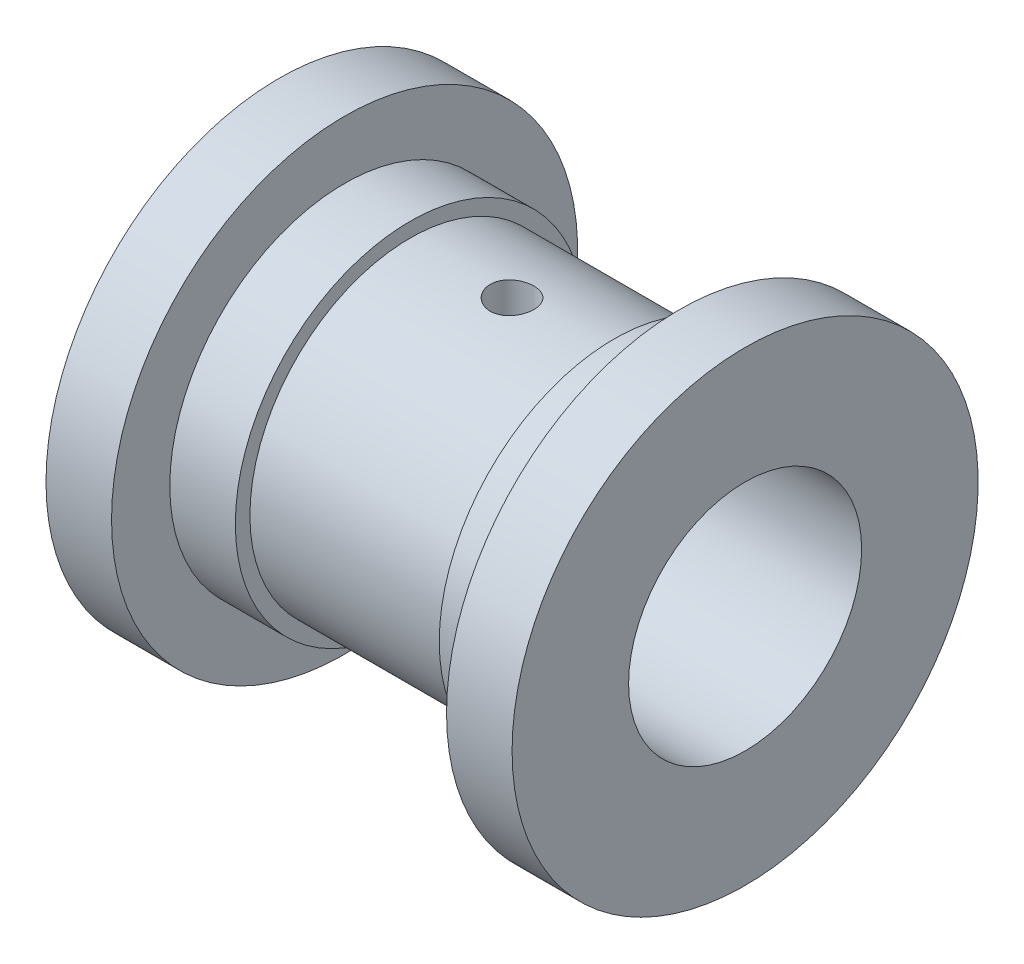
ISO-10303-21;
HEADER;
FILE_DESCRIPTION(('STEP AP214'),'2;1');
FILE_NAME('part.step','',(''),(''),'','','');
FILE_SCHEMA(('AUTOMOTIVE_DESIGN { 1 0 10303 214 1 1 1 1 }'));
ENDSEC;
DATA;
#1=APPLICATION_CONTEXT('core data for automotive mechanical design processes');
#2=APPLICATION_PROTOCOL_DEFINITION('international standard','automotive_design',2000,#1);
#3=PRODUCT_CONTEXT('',#1,'mechanical');
#4=PRODUCT('Part','Part','',(#3));
#5=PRODUCT_RELATED_PRODUCT_CATEGORY('part','',(#4));
#6=PRODUCT_DEFINITION_FORMATION('','',#4);
#7=PRODUCT_DEFINITION_CONTEXT('part definition',#1,'design');
#8=PRODUCT_DEFINITION('design','',#6,#7);
#9=PRODUCT_DEFINITION_SHAPE('','',#8);
#10=(LENGTH_UNIT() NAMED_UNIT(*) SI_UNIT(.MILLI.,.METRE.));
#11=(NAMED_UNIT(*) PLANE_ANGLE_UNIT() SI_UNIT($,.RADIAN.));
#12=(NAMED_UNIT(*) SI_UNIT($,.STERADIAN.) SOLID_ANGLE_UNIT());
#13=UNCERTAINTY_MEASURE_WITH_UNIT(LENGTH_MEASURE(1.E-05),#10,'distance_accuracy_value','');
#14=(GEOMETRIC_REPRESENTATION_CONTEXT(3) GLOBAL_UNCERTAINTY_ASSIGNED_CONTEXT((#13)) GLOBAL_UNIT_ASSIGNED_CONTEXT((#10,
#11,#12)) REPRESENTATION_CONTEXT('',''));
#15=CARTESIAN_POINT('',(0.,0.,0.));
#16=DIRECTION('',(0.,0.,1.));
#17=DIRECTION('',(1.,0.,0.));
#18=AXIS2_PLACEMENT_3D('',#15,#16,#17);
#19=CARTESIAN_POINT('',(-34.4291845493563,0.,0.));
#20=DIRECTION('',(-1.,0.,0.));
#21=DIRECTION('',(0.,0.,1.));
#22=AXIS2_PLACEMENT_3D('',#19,#20,#21);
#23=CYLINDRICAL_SURFACE('',#22,24.0000000000001);
#24=CARTESIAN_POINT('',(13.9999999999998,0.,0.));
#25=DIRECTION('',(-1.,0.,0.));
#26=DIRECTION('',(0.,0.,1.));
#27=AXIS2_PLACEMENT_3D('',#24,#25,#26);
#28=CIRCLE('',#27,24.0000000000001);
#29=CARTESIAN_POINT('',(13.9999999999998,0.,24.0000000000001));
#30=VERTEX_POINT('',#29);
#31=EDGE_CURVE('E12',#30,#30,#28,.T.);
#32=ORIENTED_EDGE('',*,*,#31,.F.);
#33=EDGE_LOOP('',(#32));
#34=FACE_BOUND('',#33,.T.);
#35=CARTESIAN_POINT('',(22.9999999999999,0.,0.));
#36=DIRECTION('',(-1.,0.,0.));
#37=DIRECTION('',(0.,0.,1.));
#38=AXIS2_PLACEMENT_3D('',#35,#36,#37);
#39=CIRCLE('',#38,24.0000000000002);
#40=CARTESIAN_POINT('',(22.9999999999999,0.,24.0000000000002));
#41=VERTEX_POINT('',#40);
#42=EDGE_CURVE('E81',#41,#41,#39,.T.);
#43=ORIENTED_EDGE('',*,*,#42,.T.);
#44=EDGE_LOOP('',(#43));
#45=FACE_BOUND('',#44,.T.);
#46=ADVANCED_FACE('F52',(#34,#45),#23,.T.);
#47=CARTESIAN_POINT('',(13.9999999999998,22.0000000000001,0.));
#48=DIRECTION('',(1.,0.,0.));
#49=DIRECTION('',(0.,0.,-1.));
#50=AXIS2_PLACEMENT_3D('',#47,#48,#49);
#51=PLANE('',#50);
#52=CARTESIAN_POINT('',(13.9999999999998,0.,0.));
#53=DIRECTION('',(-1.,0.,0.));
#54=DIRECTION('',(0.,0.,1.));
#55=AXIS2_PLACEMENT_3D('',#52,#53,#54);
#56=CIRCLE('',#55,22.0000000000001);
#57=CARTESIAN_POINT('',(13.9999999999998,0.,22.0000000000001));
#58=VERTEX_POINT('',#57);
#59=EDGE_CURVE('E68',#58,#58,#56,.T.);
#60=ORIENTED_EDGE('',*,*,#59,.F.);
#61=EDGE_LOOP('',(#60));
#62=FACE_BOUND('',#61,.T.);
#63=ORIENTED_EDGE('',*,*,#31,.T.);
#64=EDGE_LOOP('',(#63));
#65=FACE_BOUND('',#64,.T.);
#66=ADVANCED_FACE('F133',(#62,#65),#51,.F.);
#67=CARTESIAN_POINT('',(-34.4291845493563,0.,0.));
#68=DIRECTION('',(-1.,0.,0.));
#69=DIRECTION('',(0.,0.,1.));
#70=AXIS2_PLACEMENT_3D('',#67,#68,#69);
#71=CYLINDRICAL_SURFACE('',#70,22.);
#72=CARTESIAN_POINT('',(0.,21.7944947177035,-3.));
#73=CARTESIAN_POINT('',(0.167668655793948,21.7944973125223,-2.9999929539783));
#74=CARTESIAN_POINT('',(0.33543888557203,21.7964504822142,-2.98589613516891));
#75=CARTESIAN_POINT('',(0.666300949403478,21.8040481680047,-2.92988930626151));
#76=CARTESIAN_POINT('',(0.829387860056604,21.8096964302678,-2.88795106929477));
#77=CARTESIAN_POINT('',(1.14604557101646,21.8240329226109,-2.77752885626789));
#78=CARTESIAN_POINT('',(1.29962310318686,21.8327189725424,-2.70906391400623));
#79=CARTESIAN_POINT('',(1.59308393749808,21.8521497354894,-2.54757436301584));
#80=CARTESIAN_POINT('',(1.73296937813156,21.8628941262462,-2.4545535979434));
#81=CARTESIAN_POINT('',(1.99602918996941,21.8853107439762,-2.24593261550097));
#82=CARTESIAN_POINT('',(2.11909952067153,21.8969880962733,-2.13020174404838));
#83=CARTESIAN_POINT('',(2.34413561137156,21.919908962518,-1.87972745186891));
#84=CARTESIAN_POINT('',(2.44610027468492,21.9311524538967,-1.74498304377947));
#85=CARTESIAN_POINT('',(2.62640880979328,21.9519917823357,-1.45964673364279));
#86=CARTESIAN_POINT('',(2.70465775314382,21.9615809332172,-1.30899431491142));
#87=CARTESIAN_POINT('',(2.83470513621752,21.9779746087793,-0.996533559622184));
#88=CARTESIAN_POINT('',(2.8865047367614,21.9847792556648,-0.834725713012606));
#89=CARTESIAN_POINT('',(2.96187006393203,21.9948010960819,-0.505615027627435));
#90=CARTESIAN_POINT('',(2.98560939170292,21.9980403391052,-0.338352625202445));
#91=CARTESIAN_POINT('',(3.0047187619281,22.0006418160325,-0.00218901989867563));
#92=CARTESIAN_POINT('',(3.0000901200992,22.0000042297454,0.166712106612716));
#93=CARTESIAN_POINT('',(2.96273314482708,21.9949416293269,0.500176134095477));
#94=CARTESIAN_POINT('',(2.93019154096824,21.9905417842194,0.664760389901237));
#95=CARTESIAN_POINT('',(2.83822479796856,21.9784771616626,0.986109968659597));
#96=CARTESIAN_POINT('',(2.77879906739163,21.9708123123852,1.14287511951192));
#97=CARTESIAN_POINT('',(2.63455559502035,21.9530355245634,1.44470900216684));
#98=CARTESIAN_POINT('',(2.54965799841275,21.9429159096716,1.58973910165));
#99=CARTESIAN_POINT('',(2.35693890109397,21.9213599095811,1.86356465940336));
#100=CARTESIAN_POINT('',(2.24911615051491,21.9099234526045,1.99235923191072));
#101=CARTESIAN_POINT('',(2.0125639881594,21.8869019715346,2.23115639122854));
#102=CARTESIAN_POINT('',(1.88367170498199,21.8753164955576,2.34099765683573));
#103=CARTESIAN_POINT('',(1.60919608132633,21.8533940433535,2.53751386076588));
#104=CARTESIAN_POINT('',(1.46361266894254,21.8430570725053,2.62418869928229));
#105=CARTESIAN_POINT('',(1.15973309839799,21.8248023099057,2.77192629130128));
#106=CARTESIAN_POINT('',(1.00142980323134,21.816885888441,2.83297454471217));
#107=CARTESIAN_POINT('',(0.676685938855074,21.8043941534575,2.92757469616756));
#108=CARTESIAN_POINT('',(0.510245840045014,21.7998186470391,2.96112818173428));
#109=CARTESIAN_POINT('',(0.175382312986139,21.7945626889125,2.99956941672123));
#110=CARTESIAN_POINT('',(0.0069854967609881,21.793851292977,3.00468490854898));
#111=CARTESIAN_POINT('',(-0.328262835866369,21.7963221316712,2.98670732293097));
#112=CARTESIAN_POINT('',(-0.495114391544092,21.7995042670648,2.96361496443092));
#113=CARTESIAN_POINT('',(-0.821843465157813,21.8093753071635,2.89006955453772));
#114=CARTESIAN_POINT('',(-0.981746585492409,21.8160498979624,2.83972815512373));
#115=CARTESIAN_POINT('',(-1.29084344925954,21.8321421092609,2.71322912313731));
#116=CARTESIAN_POINT('',(-1.44003674919166,21.8415598432742,2.63707042220062));
#117=CARTESIAN_POINT('',(-1.72450521244548,21.8621508077798,2.46054424209314));
#118=CARTESIAN_POINT('',(-1.8596874322528,21.8733346554528,2.36002824545059));
#119=CARTESIAN_POINT('',(-2.11134500486869,21.8961649833417,2.13784918546693));
#120=CARTESIAN_POINT('',(-2.22781948780179,21.9078114850388,2.01618513932767));
#121=CARTESIAN_POINT('',(-2.43956305361876,21.9303506440046,1.75416517490266));
#122=CARTESIAN_POINT('',(-2.53468192892497,21.9412376115705,1.61368731048529));
#123=CARTESIAN_POINT('',(-2.69997177807763,21.9609445601932,1.3186156356417));
#124=CARTESIAN_POINT('',(-2.77014333476212,21.9697645895377,1.1640221551012));
#125=CARTESIAN_POINT('',(-2.88330205185712,21.9843187797623,0.845593617063891));
#126=CARTESIAN_POINT('',(-2.9263739872929,21.9900625555325,0.681789143548593));
#127=CARTESIAN_POINT('',(-2.98438601535218,21.9978571930976,0.349189125620978));
#128=CARTESIAN_POINT('',(-2.99932763043918,21.9999082547486,0.180393851821991));
#129=CARTESIAN_POINT('',(-3.00062266554238,22.0000849669785,-0.155933944793822));
#130=CARTESIAN_POINT('',(-2.98720691376541,21.9982423123404,-0.323465608547036));
#131=CARTESIAN_POINT('',(-2.93265946872279,21.9909020074537,-0.653868527504477));
#132=CARTESIAN_POINT('',(-2.89152782222594,21.9854043633727,-0.816739790572345));
#133=CARTESIAN_POINT('',(-2.78279281440875,21.9713688879314,-1.1331538776586));
#134=CARTESIAN_POINT('',(-2.71520266767051,21.962832574414,-1.28670131426867));
#135=CARTESIAN_POINT('',(-2.55549339551869,21.9436616719154,-1.58031159285158));
#136=CARTESIAN_POINT('',(-2.46337375671115,21.9330270390185,-1.72037415250695));
#137=CARTESIAN_POINT('',(-2.2563744265564,21.9107413064256,-1.9842147286039));
#138=CARTESIAN_POINT('',(-2.14132346408358,21.8990829513431,-2.10785776937321));
#139=CARTESIAN_POINT('',(-1.89208624401357,21.8761200052605,-2.33416948478686));
#140=CARTESIAN_POINT('',(-1.75789548220959,21.864815498298,-2.43683320845298));
#141=CARTESIAN_POINT('',(-1.47347030664262,21.8437846234674,-2.61868613380127));
#142=CARTESIAN_POINT('',(-1.3231649084022,21.8340657568727,-2.69776514213644));
#143=CARTESIAN_POINT('',(-1.0113524153603,21.817394367016,-2.8294429199818));
#144=CARTESIAN_POINT('',(-0.849857473558353,21.8104388960615,-2.8820699216208));
#145=CARTESIAN_POINT('',(-0.572977203514035,21.8017355288375,-2.94703203226376));
#146=CARTESIAN_POINT('',(-0.459323577603224,21.7990341203125,-2.96686567785599));
#147=CARTESIAN_POINT('',(-0.230462622878638,21.7954128315746,-2.99335201931174));
#148=CARTESIAN_POINT('',(-0.115255309193865,21.7944929340269,-3.00000484343008));
#149=CARTESIAN_POINT('',(0.,21.7944947177035,-3.));
#150=B_SPLINE_CURVE_WITH_KNOTS('',3,(#72,#73,#74,#75,#76,#77,#78,#79,#80,#81,#82,#83,#84,#85,
#86,#87,#88,#89,#90,#91,#92,#93,#94,#95,#96,#97,#98,#99,#100,#101,#102,#103,#104,#105,#106,#107,
#108,#109,#110,#111,#112,#113,#114,#115,#116,#117,#118,#119,#120,#121,#122,#123,#124,#125,#126,
#127,#128,#129,#130,#131,#132,#133,#134,#135,#136,#137,#138,#139,#140,#141,#142,#143,#144,#145,
#146,#147,#148,#149),.UNSPECIFIED.,.T.,.F.,(4,2,2,2,2,2,2,2,2,2,2,2,2,2,2,2,2,2,2,2,2,2,2,2,2,2,
2,2,2,2,2,2,2,2,2,2,2,2,4),(0.,0.502584827322588,1.00567997726422,1.50841480614363,
2.01107098991684,2.51670860353082,3.0223724842993,3.53003447052544,4.03767417433729,
4.54215653413512,5.04661549603351,5.54772586150297,6.04884725166252,6.5515563813218,
7.05429292546104,7.56111742626902,8.06794411056388,8.57505718337538,9.08214097388771,
9.58515792757108,10.088162060911,10.5891205844916,11.0900998411273,11.5942142584276,
12.0983521093424,12.605931923378,13.1134998781727,13.6194720220334,14.1254167809851,
14.6272590296531,15.1291004314969,15.6306915099824,16.1322930874248,16.6377918045005,
17.1434096784682,17.6513541852326,18.158755407386,18.5042352052812,18.8497116414995),.UNSPECIFIED.);
#151=CARTESIAN_POINT('',(0.,21.7944947177035,-3.));
#152=VERTEX_POINT('',#151);
#153=EDGE_CURVE('E215',#152,#152,#150,.T.);
#154=ORIENTED_EDGE('',*,*,#153,.T.);
#155=EDGE_LOOP('',(#154));
#156=FACE_BOUND('',#155,.T.);
#157=CARTESIAN_POINT('',(0.,-21.633307652784,4.));
#158=CARTESIAN_POINT('',(0.222680245145932,-21.6333118939646,3.99999133497669));
#159=CARTESIAN_POINT('',(0.445474382576035,-21.6367831728321,3.98134200846101));
#160=CARTESIAN_POINT('',(0.88478923174598,-21.650277261808,3.90728263932398));
#161=CARTESIAN_POINT('',(1.10130431933861,-21.6603057667964,3.85184064204134));
#162=CARTESIAN_POINT('',(1.52164062603706,-21.6857418061114,3.70594738579433));
#163=CARTESIAN_POINT('',(1.72547313061613,-21.7011444752348,3.61552778385547));
#164=CARTESIAN_POINT('',(2.1150597832579,-21.7355875966024,3.40232850816632));
#165=CARTESIAN_POINT('',(2.30081551603269,-21.7546277295314,3.2795516745396));
#166=CARTESIAN_POINT('',(2.65116689488345,-21.7944494758657,3.00359049647932));
#167=CARTESIAN_POINT('',(2.81552014846788,-21.8152472612913,2.85010070695623));
#168=CARTESIAN_POINT('',(3.11629112566885,-21.8560978635287,2.51773079268323));
#169=CARTESIAN_POINT('',(3.25270706729073,-21.8761506327526,2.33884904952696));
#170=CARTESIAN_POINT('',(3.49465463690044,-21.9134244798489,1.95918683799967));
#171=CARTESIAN_POINT('',(3.5999585399916,-21.9306242928061,1.75825898095974));
#172=CARTESIAN_POINT('',(3.77522666605231,-21.9600735467303,1.34119954887521));
#173=CARTESIAN_POINT('',(3.84519362101877,-21.9723233703801,1.12506915065336));
#174=CARTESIAN_POINT('',(3.94705446651093,-21.9903782117667,0.686249675641723));
#175=CARTESIAN_POINT('',(3.97935662864145,-21.996252290905,0.463658257037538));
#176=CARTESIAN_POINT('',(4.0062423349248,-22.0011316177893,0.0161429459318372));
#177=CARTESIAN_POINT('',(4.00082890714308,-22.0001374169679,-0.208780757870097));
#178=CARTESIAN_POINT('',(3.95275171584415,-21.9914463710423,-0.651778392281494));
#179=CARTESIAN_POINT('',(3.9105274929711,-21.9838286175382,-0.869901800106697));
#180=CARTESIAN_POINT('',(3.79072160507702,-21.9628349381596,-1.29591498120672));
#181=CARTESIAN_POINT('',(3.71313870922762,-21.9494588118381,-1.50380439795921));
#182=CARTESIAN_POINT('',(3.52439388044179,-21.9183184074471,-1.90473245090768));
#183=CARTESIAN_POINT('',(3.41305471193237,-21.9005310604677,-2.09768578503489));
#184=CARTESIAN_POINT('',(3.16008822015064,-21.8625379364345,-2.46233526714581));
#185=CARTESIAN_POINT('',(3.01845799412906,-21.8423319276857,-2.63402937539643));
#186=CARTESIAN_POINT('',(2.7065030908415,-21.8013981618569,-2.95388890108789));
#187=CARTESIAN_POINT('',(2.53579396416207,-21.7806670830423,-3.10167918809898));
#188=CARTESIAN_POINT('',(2.17181187215817,-21.7412992413717,-3.36658543928328));
#189=CARTESIAN_POINT('',(1.97853861446947,-21.7226625056582,-3.48370100593928));
#190=CARTESIAN_POINT('',(1.57443497902635,-21.6895894681968,-3.6840307649818));
#191=CARTESIAN_POINT('',(1.36357833672045,-21.6751596002548,-3.76719310770443));
#192=CARTESIAN_POINT('',(0.930565100223314,-21.6522346695388,-3.89680753773995));
#193=CARTESIAN_POINT('',(0.708409706977764,-21.6437389774288,-3.94326351793347));
#194=CARTESIAN_POINT('',(0.262480397589217,-21.633768081855,-3.99760435703087));
#195=CARTESIAN_POINT('',(0.0387741346607441,-21.6321950076556,-4.00602696978327));
#196=CARTESIAN_POINT('',(-0.406849101122184,-21.6359859030779,-3.98550109557701));
#197=CARTESIAN_POINT('',(-0.628766156427988,-21.6413495511774,-3.95655434071582));
#198=CARTESIAN_POINT('',(-1.06276068810463,-21.6583185875736,-3.86257219277797));
#199=CARTESIAN_POINT('',(-1.2749007680161,-21.6698756001578,-3.7978163771075));
#200=CARTESIAN_POINT('',(-1.68531943765693,-21.6978878160151,-3.63434995143753));
#201=CARTESIAN_POINT('',(-1.88359705817142,-21.7143433613546,-3.53563697012219));
#202=CARTESIAN_POINT('',(-2.26303839203054,-21.7505226830533,-3.3058117237599));
#203=CARTESIAN_POINT('',(-2.44399223616878,-21.7702800968596,-3.17435835883131));
#204=CARTESIAN_POINT('',(-2.78146738319553,-21.8107413258405,-2.88324609901471));
#205=CARTESIAN_POINT('',(-2.93798662399939,-21.8314452207001,-2.72358482602653));
#206=CARTESIAN_POINT('',(-3.22414569229964,-21.8717797209063,-2.37819260014527));
#207=CARTESIAN_POINT('',(-3.35342471072362,-21.8913936565352,-2.19216046504753));
#208=CARTESIAN_POINT('',(-3.578892612166,-21.9270616275554,-1.80070523958703));
#209=CARTESIAN_POINT('',(-3.67508271455441,-21.9431157941212,-1.59528286413569));
#210=CARTESIAN_POINT('',(-3.83109607727294,-21.9697834526315,-1.17189643669068));
#211=CARTESIAN_POINT('',(-3.89109980975307,-21.9804239020959,-0.954000658707872));
#212=CARTESIAN_POINT('',(-3.97361468659431,-21.9951799495619,-0.511013297926922));
#213=CARTESIAN_POINT('',(-3.99612953027346,-21.9992961913555,-0.285922427358434));
#214=CARTESIAN_POINT('',(-4.00290504221109,-22.0005282842777,0.161599238057638));
#215=CARTESIAN_POINT('',(-3.9877117769694,-21.9977440646225,0.384021675850886));
#216=CARTESIAN_POINT('',(-3.92069410715211,-21.9856946780428,0.823089077981702));
#217=CARTESIAN_POINT('',(-3.86887000960196,-21.9764295654387,1.03973409072761));
#218=CARTESIAN_POINT('',(-3.73028619302146,-21.9524581381546,1.46083086688082));
#219=CARTESIAN_POINT('',(-3.64358130924887,-21.93776036696,1.66530119329237));
#220=CARTESIAN_POINT('',(-3.4377611943825,-21.9045184478406,2.05687402388435));
#221=CARTESIAN_POINT('',(-3.31864396744523,-21.885974063071,2.24397545759474));
#222=CARTESIAN_POINT('',(-3.04948472287628,-21.8467718041458,2.59822919507103));
#223=CARTESIAN_POINT('',(-2.89904660923134,-21.826088758947,2.76507779716899));
#224=CARTESIAN_POINT('',(-2.5723409666129,-21.7851034058444,3.07135244710173));
#225=CARTESIAN_POINT('',(-2.39606738287675,-21.7648011884524,3.21077204872681));
#226=CARTESIAN_POINT('',(-2.02088064879774,-21.7266856567864,3.4593534360722));
#227=CARTESIAN_POINT('',(-1.82178552137727,-21.7088952940927,3.56824417003714));
#228=CARTESIAN_POINT('',(-1.40787344654802,-21.6780923491354,3.75086117813967));
#229=CARTESIAN_POINT('',(-1.19307181678438,-21.6650751844593,3.82462119925563));
#230=CARTESIAN_POINT('',(-0.814646631135513,-21.6480562150115,3.91959792411041));
#231=CARTESIAN_POINT('',(-0.653261474782786,-21.642557744208,3.94969798379533));
#232=CARTESIAN_POINT('',(-0.327938095935641,-21.6351819455147,3.98990196850046));
#233=CARTESIAN_POINT('',(-0.163999935860687,-21.6333045292319,4.00000638163151));
#234=CARTESIAN_POINT('',(0.,-21.633307652784,4.));
#235=B_SPLINE_CURVE_WITH_KNOTS('',3,(#157,#158,#159,#160,#161,#162,#163,#164,#165,#166,#167,
#168,#169,#170,#171,#172,#173,#174,#175,#176,#177,#178,#179,#180,#181,#182,#183,#184,#185,#186,
#187,#188,#189,#190,#191,#192,#193,#194,#195,#196,#197,#198,#199,#200,#201,#202,#203,#204,#205,
#206,#207,#208,#209,#210,#211,#212,#213,#214,#215,#216,#217,#218,#219,#220,#221,#222,#223,#224,
#225,#226,#227,#228,#229,#230,#231,#232,#233,#234),.UNSPECIFIED.,.T.,.F.,(4,2,2,2,2,2,2,2,2,2,2,
2,2,2,2,2,2,2,2,2,2,2,2,2,2,2,2,2,2,2,2,2,2,2,2,2,2,2,4),(0.,0.667440705257576,1.33546184685079,
2.00287979476301,2.67023918023363,3.34459870230516,4.01900122532958,4.69822425023956,
5.37739475450277,6.04913278831926,6.72081689103462,7.38458890585931,8.04838402822071,
8.71572656975954,9.38313309046878,10.0601670169629,10.7372097167831,11.4152824897346,
12.0932833402557,12.7616672929396,13.4300202666519,14.0932273132436,14.7564806826868,
15.4269564046825,16.0974886789027,16.7764104513919,17.4553072020416,18.1307894735074,
18.8062050859726,19.4718969577387,20.1375832499996,20.8022270968082,21.4669118794232,
22.1405775941433,22.8144014413678,23.4940309659146,24.1730063069363,24.6645762030324,
25.1561340993394),.UNSPECIFIED.);
#236=CARTESIAN_POINT('',(0.,-21.633307652784,4.));
#237=VERTEX_POINT('',#236);
#238=EDGE_CURVE('E80',#237,#237,#235,.T.);
#239=ORIENTED_EDGE('',*,*,#238,.T.);
#240=EDGE_LOOP('',(#239));
#241=FACE_BOUND('',#240,.T.);
#242=CARTESIAN_POINT('',(-14.,0.,0.));
#243=DIRECTION('',(-1.,0.,0.));
#244=DIRECTION('',(0.,0.,1.));
#245=AXIS2_PLACEMENT_3D('',#242,#243,#244);
#246=CIRCLE('',#245,22.);
#247=CARTESIAN_POINT('',(-14.,0.,22.));
#248=VERTEX_POINT('',#247);
#249=EDGE_CURVE('E71',#248,#248,#246,.T.);
#250=ORIENTED_EDGE('',*,*,#249,.F.);
#251=EDGE_LOOP('',(#250));
#252=FACE_BOUND('',#251,.T.);
#253=ORIENTED_EDGE('',*,*,#59,.T.);
#254=EDGE_LOOP('',(#253));
#255=FACE_BOUND('',#254,.T.);
#256=ADVANCED_FACE('F93',(#156,#241,#252,#255),#71,.T.);
#257=CARTESIAN_POINT('',(-14.,22.,0.));
#258=DIRECTION('',(-1.,0.,0.));
#259=DIRECTION('',(0.,0.,1.));
#260=AXIS2_PLACEMENT_3D('',#257,#258,#259);
#261=PLANE('',#260);
#262=CARTESIAN_POINT('',(-14.,0.,0.));
#263=DIRECTION('',(-1.,0.,0.));
#264=DIRECTION('',(0.,0.,1.));
#265=AXIS2_PLACEMENT_3D('',#262,#263,#264);
#266=CIRCLE('',#265,24.);
#267=CARTESIAN_POINT('',(-14.,0.,24.));
#268=VERTEX_POINT('',#267);
#269=EDGE_CURVE('E173',#268,#268,#266,.T.);
#270=ORIENTED_EDGE('',*,*,#269,.F.);
#271=EDGE_LOOP('',(#270));
#272=FACE_BOUND('',#271,.T.);
#273=ORIENTED_EDGE('',*,*,#249,.T.);
#274=EDGE_LOOP('',(#273));
#275=FACE_BOUND('',#274,.T.);
#276=ADVANCED_FACE('F130',(#272,#275),#261,.F.);
#277=CARTESIAN_POINT('',(-34.4291845493563,0.,0.));
#278=DIRECTION('',(-1.,0.,0.));
#279=DIRECTION('',(0.,0.,1.));
#280=AXIS2_PLACEMENT_3D('',#277,#278,#279);
#281=CYLINDRICAL_SURFACE('',#280,24.);
#282=CARTESIAN_POINT('',(-22.9999999999999,0.,0.));
#283=DIRECTION('',(-1.,0.,0.));
#284=DIRECTION('',(0.,0.,1.));
#285=AXIS2_PLACEMENT_3D('',#282,#283,#284);
#286=CIRCLE('',#285,24.);
#287=CARTESIAN_POINT('',(-22.9999999999999,0.,24.));
#288=VERTEX_POINT('',#287);
#289=EDGE_CURVE('E172',#288,#288,#286,.T.);
#290=ORIENTED_EDGE('',*,*,#289,.F.);
#291=EDGE_LOOP('',(#290));
#292=FACE_BOUND('',#291,.T.);
#293=ORIENTED_EDGE('',*,*,#269,.T.);
#294=EDGE_LOOP('',(#293));
#295=FACE_BOUND('',#294,.T.);
#296=ADVANCED_FACE('F125',(#292,#295),#281,.T.);
#297=CARTESIAN_POINT('',(-22.9999999999999,24.,0.));
#298=DIRECTION('',(-1.,0.,0.));
#299=DIRECTION('',(0.,0.,1.));
#300=AXIS2_PLACEMENT_3D('',#297,#298,#299);
#301=PLANE('',#300);
#302=CARTESIAN_POINT('',(-22.9999999999999,0.,0.));
#303=DIRECTION('',(-1.,0.,0.));
#304=DIRECTION('',(0.,0.,1.));
#305=AXIS2_PLACEMENT_3D('',#302,#303,#304);
#306=CIRCLE('',#305,32.);
#307=CARTESIAN_POINT('',(-22.9999999999999,0.,32.));
#308=VERTEX_POINT('',#307);
#309=EDGE_CURVE('E170',#308,#308,#306,.T.);
#310=ORIENTED_EDGE('',*,*,#309,.F.);
#311=EDGE_LOOP('',(#310));
#312=FACE_BOUND('',#311,.T.);
#313=ORIENTED_EDGE('',*,*,#289,.T.);
#314=EDGE_LOOP('',(#313));
#315=FACE_BOUND('',#314,.T.);
#316=ADVANCED_FACE('F118',(#312,#315),#301,.F.);
#317=CARTESIAN_POINT('',(-34.4291845493563,0.,0.));
#318=DIRECTION('',(-1.,0.,0.));
#319=DIRECTION('',(0.,0.,1.));
#320=AXIS2_PLACEMENT_3D('',#317,#318,#319);
#321=CYLINDRICAL_SURFACE('',#320,32.);
#322=CARTESIAN_POINT('',(-32.,0.,0.));
#323=DIRECTION('',(-1.,0.,0.));
#324=DIRECTION('',(0.,0.,1.));
#325=AXIS2_PLACEMENT_3D('',#322,#323,#324);
#326=CIRCLE('',#325,32.);
#327=CARTESIAN_POINT('',(-32.,0.,32.));
#328=VERTEX_POINT('',#327);
#329=EDGE_CURVE('E162',#328,#328,#326,.T.);
#330=ORIENTED_EDGE('',*,*,#329,.F.);
#331=EDGE_LOOP('',(#330));
#332=FACE_BOUND('',#331,.T.);
#333=ORIENTED_EDGE('',*,*,#309,.T.);
#334=EDGE_LOOP('',(#333));
#335=FACE_BOUND('',#334,.T.);
#336=ADVANCED_FACE('F117',(#332,#335),#321,.T.);
#337=CARTESIAN_POINT('',(-32.,32.,0.));
#338=DIRECTION('',(1.,0.,0.));
#339=DIRECTION('',(0.,0.,-1.));
#340=AXIS2_PLACEMENT_3D('',#337,#338,#339);
#341=PLANE('',#340);
#342=CARTESIAN_POINT('',(-32.,0.,0.));
#343=DIRECTION('',(1.,0.,0.));
#344=DIRECTION('',(0.,0.,-1.));
#345=AXIS2_PLACEMENT_3D('',#342,#343,#344);
#346=CIRCLE('',#345,16.);
#347=CARTESIAN_POINT('',(-32.,0.,-16.));
#348=VERTEX_POINT('',#347);
#349=EDGE_CURVE('E204',#348,#348,#346,.F.);
#350=ORIENTED_EDGE('',*,*,#349,.F.);
#351=EDGE_LOOP('',(#350));
#352=FACE_BOUND('',#351,.T.);
#353=ORIENTED_EDGE('',*,*,#329,.T.);
#354=EDGE_LOOP('',(#353));
#355=FACE_BOUND('',#354,.T.);
#356=ADVANCED_FACE('F115',(#352,#355),#341,.F.);
#357=CARTESIAN_POINT('',(31.9999999999998,32.0000000000002,0.));
#358=DIRECTION('',(-1.,0.,0.));
#359=DIRECTION('',(0.,0.,1.));
#360=AXIS2_PLACEMENT_3D('',#357,#358,#359);
#361=PLANE('',#360);
#362=CARTESIAN_POINT('',(31.9999999999998,0.,0.));
#363=DIRECTION('',(1.,0.,0.));
#364=DIRECTION('',(0.,0.,-1.));
#365=AXIS2_PLACEMENT_3D('',#362,#363,#364);
#366=CIRCLE('',#365,16.);
#367=CARTESIAN_POINT('',(31.9999999999998,0.,-16.));
#368=VERTEX_POINT('',#367);
#369=EDGE_CURVE('E208',#368,#368,#366,.T.);
#370=ORIENTED_EDGE('',*,*,#369,.F.);
#371=EDGE_LOOP('',(#370));
#372=FACE_BOUND('',#371,.T.);
#373=CARTESIAN_POINT('',(31.9999999999998,0.,0.));
#374=DIRECTION('',(-1.,0.,0.));
#375=DIRECTION('',(0.,0.,1.));
#376=AXIS2_PLACEMENT_3D('',#373,#374,#375);
#377=CIRCLE('',#376,32.0000000000002);
#378=CARTESIAN_POINT('',(31.9999999999998,0.,32.0000000000002));
#379=VERTEX_POINT('',#378);
#380=EDGE_CURVE('E154',#379,#379,#377,.T.);
#381=ORIENTED_EDGE('',*,*,#380,.F.);
#382=EDGE_LOOP('',(#381));
#383=FACE_BOUND('',#382,.T.);
#384=ADVANCED_FACE('F107',(#372,#383),#361,.F.);
#385=CARTESIAN_POINT('',(-34.4291845493563,0.,0.));
#386=DIRECTION('',(-1.,0.,0.));
#387=DIRECTION('',(0.,0.,1.));
#388=AXIS2_PLACEMENT_3D('',#385,#386,#387);
#389=CYLINDRICAL_SURFACE('',#388,32.0000000000002);
#390=CARTESIAN_POINT('',(22.9999999999997,0.,0.));
#391=DIRECTION('',(-1.,0.,0.));
#392=DIRECTION('',(0.,0.,1.));
#393=AXIS2_PLACEMENT_3D('',#390,#391,#392);
#394=CIRCLE('',#393,32.0000000000002);
#395=CARTESIAN_POINT('',(22.9999999999997,0.,32.0000000000002));
#396=VERTEX_POINT('',#395);
#397=EDGE_CURVE('E147',#396,#396,#394,.T.);
#398=ORIENTED_EDGE('',*,*,#397,.F.);
#399=EDGE_LOOP('',(#398));
#400=FACE_BOUND('',#399,.T.);
#401=ORIENTED_EDGE('',*,*,#380,.T.);
#402=EDGE_LOOP('',(#401));
#403=FACE_BOUND('',#402,.T.);
#404=ADVANCED_FACE('F102',(#400,#403),#389,.T.);
#405=CARTESIAN_POINT('',(22.9999999999999,24.0000000000001,0.));
#406=DIRECTION('',(1.,0.,0.));
#407=DIRECTION('',(0.,0.,-1.));
#408=AXIS2_PLACEMENT_3D('',#405,#406,#407);
#409=PLANE('',#408);
#410=ORIENTED_EDGE('',*,*,#42,.F.);
#411=EDGE_LOOP('',(#410));
#412=FACE_BOUND('',#411,.T.);
#413=ORIENTED_EDGE('',*,*,#397,.T.);
#414=EDGE_LOOP('',(#413));
#415=FACE_BOUND('',#414,.T.);
#416=ADVANCED_FACE('F99',(#412,#415),#409,.F.);
#417=CARTESIAN_POINT('',(0.,-30.,0.));
#418=DIRECTION('',(0.,1.,0.));
#419=DIRECTION('',(0.,0.,1.));
#420=AXIS2_PLACEMENT_3D('',#417,#418,#419);
#421=CYLINDRICAL_SURFACE('',#420,4.);
#422=CARTESIAN_POINT('',(0.,-30.,0.));
#423=DIRECTION('',(0.,1.,0.));
#424=DIRECTION('',(0.,0.,1.));
#425=AXIS2_PLACEMENT_3D('',#422,#423,#424);
#426=CIRCLE('',#425,4.);
#427=CARTESIAN_POINT('',(0.,-30.,4.));
#428=VERTEX_POINT('',#427);
#429=EDGE_CURVE('E88',#428,#428,#426,.T.);
#430=ORIENTED_EDGE('',*,*,#429,.T.);
#431=EDGE_LOOP('',(#430));
#432=FACE_BOUND('',#431,.T.);
#433=ORIENTED_EDGE('',*,*,#238,.F.);
#434=EDGE_LOOP('',(#433));
#435=FACE_BOUND('',#434,.T.);
#436=ADVANCED_FACE('F94',(#432,#435),#421,.T.);
#437=CARTESIAN_POINT('',(0.,-30.,0.));
#438=DIRECTION('',(0.,1.,0.));
#439=DIRECTION('',(0.,0.,1.));
#440=AXIS2_PLACEMENT_3D('',#437,#438,#439);
#441=PLANE('',#440);
#442=CARTESIAN_POINT('',(0.,-30.,0.));
#443=DIRECTION('',(0.,-1.,0.));
#444=DIRECTION('',(0.,0.,-1.));
#445=AXIS2_PLACEMENT_3D('',#442,#443,#444);
#446=CIRCLE('',#445,3.);
#447=CARTESIAN_POINT('',(0.,-30.,-3.));
#448=VERTEX_POINT('',#447);
#449=EDGE_CURVE('E218',#448,#448,#446,.T.);
#450=ORIENTED_EDGE('',*,*,#449,.F.);
#451=EDGE_LOOP('',(#450));
#452=FACE_BOUND('',#451,.T.);
#453=ORIENTED_EDGE('',*,*,#429,.F.);
#454=EDGE_LOOP('',(#453));
#455=FACE_BOUND('',#454,.T.);
#456=ADVANCED_FACE('F97',(#452,#455),#441,.F.);
#457=CARTESIAN_POINT('',(-77.2548339959391,0.,0.));
#458=DIRECTION('',(1.,0.,0.));
#459=DIRECTION('',(0.,0.,-1.));
#460=AXIS2_PLACEMENT_3D('',#457,#458,#459);
#461=CYLINDRICAL_SURFACE('',#460,16.);
#462=CARTESIAN_POINT('',(0.,15.7162336455017,-3.));
#463=CARTESIAN_POINT('',(-0.166914416025258,15.7162368759013,-2.99999359766588));
#464=CARTESIAN_POINT('',(-0.333911896437284,15.7189215952138,-2.98602252697895));
#465=CARTESIAN_POINT('',(-0.663197923163416,15.7293570202788,-2.93054506503585));
#466=CARTESIAN_POINT('',(-0.825482352854929,15.7371120234619,-2.88901531536952));
#467=CARTESIAN_POINT('',(-1.14053014274196,15.7567795293,-2.77974071235588));
#468=CARTESIAN_POINT('',(-1.29330221861464,15.7686881581205,-2.71202027908752));
#469=CARTESIAN_POINT('',(-1.58530711857355,15.7953165264186,-2.55235131520729));
#470=CARTESIAN_POINT('',(-1.72454099800652,15.8100360465123,-2.46040467518386));
#471=CARTESIAN_POINT('',(-1.98726039839821,15.8408322967791,-2.25367357885247));
#472=CARTESIAN_POINT('',(-2.11055296694344,15.8569223325136,-2.13864585866187));
#473=CARTESIAN_POINT('',(-2.33620877919911,15.8885291532806,-1.88954355760711));
#474=CARTESIAN_POINT('',(-2.43857064884953,15.9040459006231,-1.75546772724986));
#475=CARTESIAN_POINT('',(-2.620198753201,15.9329003565681,-1.47080778914029));
#476=CARTESIAN_POINT('',(-2.69928306703887,15.9462205610473,-1.32010568006772));
#477=CARTESIAN_POINT('',(-2.83093908454705,15.9690321726586,-1.00726256650151));
#478=CARTESIAN_POINT('',(-2.88351296798033,15.9785238945667,-0.845122503718973));
#479=CARTESIAN_POINT('',(-2.96005909722216,15.9925151024756,-0.516005492374787));
#480=CARTESIAN_POINT('',(-2.98435661184537,15.9970713195266,-0.349106646489689));
#481=CARTESIAN_POINT('',(-3.00467377540081,16.0008736923119,-0.013543352070766));
#482=CARTESIAN_POINT('',(-3.00069583227803,16.0001203002139,0.155120944895335));
#483=CARTESIAN_POINT('',(-2.9648244577056,15.9934326752648,0.487196715798788));
#484=CARTESIAN_POINT('',(-2.93328126113995,15.9875634449443,0.650647520902938));
#485=CARTESIAN_POINT('',(-2.84372870120956,15.9713765266712,0.969894331430938));
#486=CARTESIAN_POINT('',(-2.7857183733084,15.9610586765993,1.12569005765305));
#487=CARTESIAN_POINT('',(-2.6445445378834,15.9370252059468,1.42622013150302));
#488=CARTESIAN_POINT('',(-2.56124102417502,15.9232907518165,1.57088714367707));
#489=CARTESIAN_POINT('',(-2.37194866184567,15.893942950857,1.84431995442928));
#490=CARTESIAN_POINT('',(-2.26595750622476,15.8783294130233,1.97308413382155));
#491=CARTESIAN_POINT('',(-2.03236859403285,15.8466702736113,2.21313123793805));
#492=CARTESIAN_POINT('',(-1.90446443219581,15.8306217180324,2.32411581514082));
#493=CARTESIAN_POINT('',(-1.63170093744278,15.8001301784924,2.52310343702522));
#494=CARTESIAN_POINT('',(-1.48684135647078,15.785687218027,2.61110614542365));
#495=CARTESIAN_POINT('',(-1.18388345859476,15.7600378661424,2.76171704448955));
#496=CARTESIAN_POINT('',(-1.0257630856188,15.7488370106052,2.82428187290841));
#497=CARTESIAN_POINT('',(-0.700997631753686,15.7310248479338,2.92187313950108));
#498=CARTESIAN_POINT('',(-0.534353519070521,15.7244130207724,2.95690269802211));
#499=CARTESIAN_POINT('',(-0.199961342288307,15.7166304060201,2.99799345299475));
#500=CARTESIAN_POINT('',(-0.0322677688690104,15.7153791163227,3.00448328571717));
#501=CARTESIAN_POINT('',(0.301806910174305,15.7182438284168,2.9894593776345));
#502=CARTESIAN_POINT('',(0.468188080296199,15.7223595647722,2.96794702172866));
#503=CARTESIAN_POINT('',(0.793505806108811,15.7354196012641,2.89789736391764));
#504=CARTESIAN_POINT('',(0.952492505249807,15.7443237338176,2.84958477167978));
#505=CARTESIAN_POINT('',(1.2601143794603,15.7659226831324,2.7275444875812));
#506=CARTESIAN_POINT('',(1.40874879063064,15.7786177792656,2.65381492257591));
#507=CARTESIAN_POINT('',(1.69333523808631,15.8065515572736,2.48204706239323));
#508=CARTESIAN_POINT('',(1.82912107573213,15.8218179085063,2.38373799279246));
#509=CARTESIAN_POINT('',(2.08242408042862,15.853096227362,2.16596688688495));
#510=CARTESIAN_POINT('',(2.19993960311148,15.8691082619299,2.04650294866166));
#511=CARTESIAN_POINT('',(2.4149675270682,15.9003324801189,1.78789883574076));
#512=CARTESIAN_POINT('',(2.51219165321193,15.9155311166661,1.64851706819181));
#513=CARTESIAN_POINT('',(2.6818424123553,15.943188096207,1.35514904608031));
#514=CARTESIAN_POINT('',(2.75427000004992,15.9556465446945,1.20116335407705));
#515=CARTESIAN_POINT('',(2.87184019572806,15.9763611599169,0.883755083157341));
#516=CARTESIAN_POINT('',(2.91712437512278,15.9846390946028,0.720386426157965));
#517=CARTESIAN_POINT('',(2.97957409657981,15.9961528416749,0.388192454763142));
#518=CARTESIAN_POINT('',(2.99674259732548,15.9993891845988,0.219367716431697));
#519=CARTESIAN_POINT('',(3.00237060303696,16.0004445503087,-0.116181520501016));
#520=CARTESIAN_POINT('',(2.99126550625912,15.9983457325,-0.282898614132521));
#521=CARTESIAN_POINT('',(2.94161514446306,15.9891373322347,-0.612046738558437));
#522=CARTESIAN_POINT('',(2.90307014251139,15.9820277978157,-0.774477810427482));
#523=CARTESIAN_POINT('',(2.79981758523268,15.9635967595585,-1.09021295119093));
#524=CARTESIAN_POINT('',(2.73515637423854,15.9522827196228,-1.2435326386362));
#525=CARTESIAN_POINT('',(2.58155909268902,15.9266674413841,-1.53721126263376));
#526=CARTESIAN_POINT('',(2.49262139578446,15.912366002962,-1.67756933000774));
#527=CARTESIAN_POINT('',(2.29149709111747,15.8820955971661,-1.94351005555888));
#528=CARTESIAN_POINT('',(2.17899593228476,15.8661056917023,-2.06885247077672));
#529=CARTESIAN_POINT('',(1.93459087500635,15.8343926708998,-2.29903072131411));
#530=CARTESIAN_POINT('',(1.80268241922184,15.8186696191953,-2.40386172651196));
#531=CARTESIAN_POINT('',(1.52174709061978,15.7891115480538,-2.590952678894));
#532=CARTESIAN_POINT('',(1.37257312077136,15.7752953438736,-2.67299481058047));
#533=CARTESIAN_POINT('',(1.0623484201479,15.7513416912985,-2.81072264841154));
#534=CARTESIAN_POINT('',(0.901309066849265,15.7412007725928,-2.86643323276463));
#535=CARTESIAN_POINT('',(0.616495423852264,15.7278603261272,-2.93859453193229));
#536=CARTESIAN_POINT('',(0.494388552471807,15.7235262144357,-2.96158211479939));
#537=CARTESIAN_POINT('',(0.248203063163675,15.717711711833,-2.99228702152192));
#538=CARTESIAN_POINT('',(0.124124499000657,15.7162312432422,-3.00000476104182));
#539=CARTESIAN_POINT('',(0.,15.7162336455017,-3.));
#540=B_SPLINE_CURVE_WITH_KNOTS('',3,(#462,#463,#464,#465,#466,#467,#468,#469,#470,#471,#472,
#473,#474,#475,#476,#477,#478,#479,#480,#481,#482,#483,#484,#485,#486,#487,#488,#489,#490,#491,
#492,#493,#494,#495,#496,#497,#498,#499,#500,#501,#502,#503,#504,#505,#506,#507,#508,#509,#510,
#511,#512,#513,#514,#515,#516,#517,#518,#519,#520,#521,#522,#523,#524,#525,#526,#527,#528,#529,
#530,#531,#532,#533,#534,#535,#536,#537,#538,#539),.UNSPECIFIED.,.T.,.F.,(4,2,2,2,2,2,2,2,2,2,2,
2,2,2,2,2,2,2,2,2,2,2,2,2,2,2,2,2,2,2,2,2,2,2,2,2,2,2,4),(0.,0.500289011586429,1.00100260476088,
1.50125045595687,2.00145927987809,2.5072467139738,3.01306734138631,3.52274208696096,
4.03237491879281,4.53608550920521,5.03975320401294,5.53711301197445,6.03449094656841,
6.53467383968434,7.03490761823573,7.54281229528125,8.05072440384789,8.55949872236519,
9.06821537732961,9.56926497174144,10.0702897867744,10.5671758463073,11.0640985324862,
11.5667572530828,12.0694611878935,12.5788825099173,13.088284216434,13.5950053883736,
14.1016732333465,14.6005860114027,15.0994940064433,15.5975205306072,16.0955804271422,
16.6007692801749,17.1060769546153,17.6160600363781,18.1255603150175,18.4976061505794,
18.8696418584436),.UNSPECIFIED.);
#541=CARTESIAN_POINT('',(0.,15.7162336455017,-3.));
#542=VERTEX_POINT('',#541);
#543=EDGE_CURVE('E57',#542,#542,#540,.T.);
#544=ORIENTED_EDGE('',*,*,#543,.T.);
#545=EDGE_LOOP('',(#544));
#546=FACE_BOUND('',#545,.T.);
#547=CARTESIAN_POINT('',(0.,-15.7162336455017,-3.));
#548=CARTESIAN_POINT('',(0.166914416025258,-15.7162368759013,-2.99999359766588));
#549=CARTESIAN_POINT('',(0.333911896437284,-15.7189215952138,-2.98602252697895));
#550=CARTESIAN_POINT('',(0.663197923163416,-15.7293570202788,-2.93054506503585));
#551=CARTESIAN_POINT('',(0.825482352854929,-15.7371120234619,-2.88901531536952));
#552=CARTESIAN_POINT('',(1.14053014274196,-15.7567795293,-2.77974071235588));
#553=CARTESIAN_POINT('',(1.29330221861464,-15.7686881581205,-2.71202027908752));
#554=CARTESIAN_POINT('',(1.58530711857355,-15.7953165264186,-2.55235131520729));
#555=CARTESIAN_POINT('',(1.72454099800652,-15.8100360465123,-2.46040467518386));
#556=CARTESIAN_POINT('',(1.98726039839821,-15.8408322967791,-2.25367357885247));
#557=CARTESIAN_POINT('',(2.11055296694344,-15.8569223325136,-2.13864585866187));
#558=CARTESIAN_POINT('',(2.33620877919911,-15.8885291532806,-1.88954355760711));
#559=CARTESIAN_POINT('',(2.43857064884953,-15.9040459006231,-1.75546772724986));
#560=CARTESIAN_POINT('',(2.620198753201,-15.9329003565681,-1.47080778914029));
#561=CARTESIAN_POINT('',(2.69928306703887,-15.9462205610473,-1.32010568006772));
#562=CARTESIAN_POINT('',(2.83093908454705,-15.9690321726586,-1.00726256650151));
#563=CARTESIAN_POINT('',(2.88351296798033,-15.9785238945667,-0.845122503718973));
#564=CARTESIAN_POINT('',(2.96005909722216,-15.9925151024756,-0.516005492374787));
#565=CARTESIAN_POINT('',(2.98435661184537,-15.9970713195266,-0.349106646489689));
#566=CARTESIAN_POINT('',(3.00467377540081,-16.0008736923119,-0.013543352070766));
#567=CARTESIAN_POINT('',(3.00069583227803,-16.0001203002139,0.155120944895335));
#568=CARTESIAN_POINT('',(2.9648244577056,-15.9934326752648,0.487196715798788));
#569=CARTESIAN_POINT('',(2.93328126113995,-15.9875634449443,0.650647520902938));
#570=CARTESIAN_POINT('',(2.84372870120956,-15.9713765266712,0.969894331430938));
#571=CARTESIAN_POINT('',(2.7857183733084,-15.9610586765993,1.12569005765305));
#572=CARTESIAN_POINT('',(2.6445445378834,-15.9370252059468,1.42622013150302));
#573=CARTESIAN_POINT('',(2.56124102417502,-15.9232907518165,1.57088714367707));
#574=CARTESIAN_POINT('',(2.37194866184567,-15.893942950857,1.84431995442928));
#575=CARTESIAN_POINT('',(2.26595750622476,-15.8783294130233,1.97308413382155));
#576=CARTESIAN_POINT('',(2.03236859403285,-15.8466702736113,2.21313123793805));
#577=CARTESIAN_POINT('',(1.90446443219581,-15.8306217180324,2.32411581514082));
#578=CARTESIAN_POINT('',(1.63170093744278,-15.8001301784924,2.52310343702522));
#579=CARTESIAN_POINT('',(1.48684135647078,-15.785687218027,2.61110614542365));
#580=CARTESIAN_POINT('',(1.18388345859476,-15.7600378661424,2.76171704448955));
#581=CARTESIAN_POINT('',(1.0257630856188,-15.7488370106052,2.82428187290841));
#582=CARTESIAN_POINT('',(0.700997631753686,-15.7310248479338,2.92187313950108));
#583=CARTESIAN_POINT('',(0.534353519070521,-15.7244130207724,2.95690269802211));
#584=CARTESIAN_POINT('',(0.199961342288307,-15.7166304060201,2.99799345299475));
#585=CARTESIAN_POINT('',(0.0322677688690104,-15.7153791163227,3.00448328571717));
#586=CARTESIAN_POINT('',(-0.301806910174305,-15.7182438284168,2.9894593776345));
#587=CARTESIAN_POINT('',(-0.468188080296199,-15.7223595647722,2.96794702172866));
#588=CARTESIAN_POINT('',(-0.793505806108811,-15.7354196012641,2.89789736391764));
#589=CARTESIAN_POINT('',(-0.952492505249807,-15.7443237338176,2.84958477167978));
#590=CARTESIAN_POINT('',(-1.2601143794603,-15.7659226831324,2.7275444875812));
#591=CARTESIAN_POINT('',(-1.40874879063064,-15.7786177792656,2.65381492257591));
#592=CARTESIAN_POINT('',(-1.69333523808631,-15.8065515572736,2.48204706239323));
#593=CARTESIAN_POINT('',(-1.82912107573213,-15.8218179085063,2.38373799279246));
#594=CARTESIAN_POINT('',(-2.08242408042862,-15.853096227362,2.16596688688495));
#595=CARTESIAN_POINT('',(-2.19993960311148,-15.8691082619299,2.04650294866166));
#596=CARTESIAN_POINT('',(-2.4149675270682,-15.9003324801189,1.78789883574076));
#597=CARTESIAN_POINT('',(-2.51219165321193,-15.9155311166661,1.64851706819181));
#598=CARTESIAN_POINT('',(-2.6818424123553,-15.943188096207,1.35514904608031));
#599=CARTESIAN_POINT('',(-2.75427000004992,-15.9556465446945,1.20116335407705));
#600=CARTESIAN_POINT('',(-2.87184019572806,-15.9763611599169,0.883755083157341));
#601=CARTESIAN_POINT('',(-2.91712437512278,-15.9846390946028,0.720386426157965));
#602=CARTESIAN_POINT('',(-2.97957409657981,-15.9961528416749,0.388192454763142));
#603=CARTESIAN_POINT('',(-2.99674259732548,-15.9993891845988,0.219367716431697));
#604=CARTESIAN_POINT('',(-3.00237060303696,-16.0004445503087,-0.116181520501016));
#605=CARTESIAN_POINT('',(-2.99126550625912,-15.9983457325,-0.282898614132521));
#606=CARTESIAN_POINT('',(-2.94161514446306,-15.9891373322347,-0.612046738558437));
#607=CARTESIAN_POINT('',(-2.90307014251139,-15.9820277978157,-0.774477810427482));
#608=CARTESIAN_POINT('',(-2.79981758523268,-15.9635967595585,-1.09021295119093));
#609=CARTESIAN_POINT('',(-2.73515637423854,-15.9522827196228,-1.2435326386362));
#610=CARTESIAN_POINT('',(-2.58155909268902,-15.9266674413841,-1.53721126263376));
#611=CARTESIAN_POINT('',(-2.49262139578446,-15.912366002962,-1.67756933000774));
#612=CARTESIAN_POINT('',(-2.29149709111747,-15.8820955971661,-1.94351005555888));
#613=CARTESIAN_POINT('',(-2.17899593228476,-15.8661056917023,-2.06885247077672));
#614=CARTESIAN_POINT('',(-1.93459087500635,-15.8343926708998,-2.29903072131411));
#615=CARTESIAN_POINT('',(-1.80268241922184,-15.8186696191953,-2.40386172651196));
#616=CARTESIAN_POINT('',(-1.52174709061978,-15.7891115480538,-2.590952678894));
#617=CARTESIAN_POINT('',(-1.37257312077136,-15.7752953438736,-2.67299481058047));
#618=CARTESIAN_POINT('',(-1.0623484201479,-15.7513416912985,-2.81072264841154));
#619=CARTESIAN_POINT('',(-0.901309066849265,-15.7412007725928,-2.86643323276463));
#620=CARTESIAN_POINT('',(-0.616495423852264,-15.7278603261272,-2.93859453193229));
#621=CARTESIAN_POINT('',(-0.494388552471807,-15.7235262144357,-2.96158211479939));
#622=CARTESIAN_POINT('',(-0.248203063163675,-15.717711711833,-2.99228702152192));
#623=CARTESIAN_POINT('',(-0.124124499000657,-15.7162312432422,-3.00000476104182));
#624=CARTESIAN_POINT('',(0.,-15.7162336455017,-3.));
#625=B_SPLINE_CURVE_WITH_KNOTS('',3,(#547,#548,#549,#550,#551,#552,#553,#554,#555,#556,#557,
#558,#559,#560,#561,#562,#563,#564,#565,#566,#567,#568,#569,#570,#571,#572,#573,#574,#575,#576,
#577,#578,#579,#580,#581,#582,#583,#584,#585,#586,#587,#588,#589,#590,#591,#592,#593,#594,#595,
#596,#597,#598,#599,#600,#601,#602,#603,#604,#605,#606,#607,#608,#609,#610,#611,#612,#613,#614,
#615,#616,#617,#618,#619,#620,#621,#622,#623,#624),.UNSPECIFIED.,.T.,.F.,(4,2,2,2,2,2,2,2,2,2,2,
2,2,2,2,2,2,2,2,2,2,2,2,2,2,2,2,2,2,2,2,2,2,2,2,2,2,2,4),(0.,0.500289011586429,1.00100260476088,
1.50125045595687,2.00145927987809,2.5072467139738,3.01306734138631,3.52274208696096,
4.03237491879281,4.53608550920521,5.03975320401294,5.53711301197445,6.03449094656841,
6.53467383968434,7.03490761823573,7.54281229528125,8.05072440384789,8.55949872236519,
9.06821537732961,9.56926497174144,10.0702897867744,10.5671758463073,11.0640985324862,
11.5667572530828,12.0694611878935,12.5788825099173,13.088284216434,13.5950053883736,
14.1016732333465,14.6005860114027,15.0994940064433,15.5975205306072,16.0955804271422,
16.6007692801749,17.1060769546153,17.6160600363781,18.1255603150175,18.4976061505794,
18.8696418584436),.UNSPECIFIED.);
#626=CARTESIAN_POINT('',(0.,-15.7162336455017,-3.));
#627=VERTEX_POINT('',#626);
#628=EDGE_CURVE('E87',#627,#627,#625,.T.);
#629=ORIENTED_EDGE('',*,*,#628,.T.);
#630=EDGE_LOOP('',(#629));
#631=FACE_BOUND('',#630,.T.);
#632=ORIENTED_EDGE('',*,*,#349,.T.);
#633=EDGE_LOOP('',(#632));
#634=FACE_BOUND('',#633,.T.);
#635=ORIENTED_EDGE('',*,*,#369,.T.);
#636=EDGE_LOOP('',(#635));
#637=FACE_BOUND('',#636,.T.);
#638=ADVANCED_FACE('F223',(#546,#631,#634,#637),#461,.F.);
#639=CARTESIAN_POINT('',(0.,32.0000000000002,0.));
#640=DIRECTION('',(0.,-1.,0.));
#641=DIRECTION('',(0.,0.,-1.));
#642=AXIS2_PLACEMENT_3D('',#639,#640,#641);
#643=CYLINDRICAL_SURFACE('',#642,3.);
#644=ORIENTED_EDGE('',*,*,#449,.T.);
#645=EDGE_LOOP('',(#644));
#646=FACE_BOUND('',#645,.T.);
#647=ORIENTED_EDGE('',*,*,#628,.F.);
#648=EDGE_LOOP('',(#647));
#649=FACE_BOUND('',#648,.T.);
#650=ADVANCED_FACE('F224',(#646,#649),#643,.F.);
#651=ORIENTED_EDGE('',*,*,#543,.F.);
#652=EDGE_LOOP('',(#651));
#653=FACE_BOUND('',#652,.T.);
#654=ORIENTED_EDGE('',*,*,#153,.F.);
#655=EDGE_LOOP('',(#654));
#656=FACE_BOUND('',#655,.T.);
#657=ADVANCED_FACE('F219',(#653,#656),#643,.F.);
#658=CLOSED_SHELL('',(#46,#66,#256,#276,#296,#316,#336,#356,#384,#404,#416,#436,#456,#638,#650,#657));
#659=MANIFOLD_SOLID_BREP('B2',#658);
#660=ADVANCED_BREP_SHAPE_REPRESENTATION('',(#18,#659),#14);
#661=SHAPE_DEFINITION_REPRESENTATION(#9,#660);
ENDSEC;
END-ISO-10303-21;
